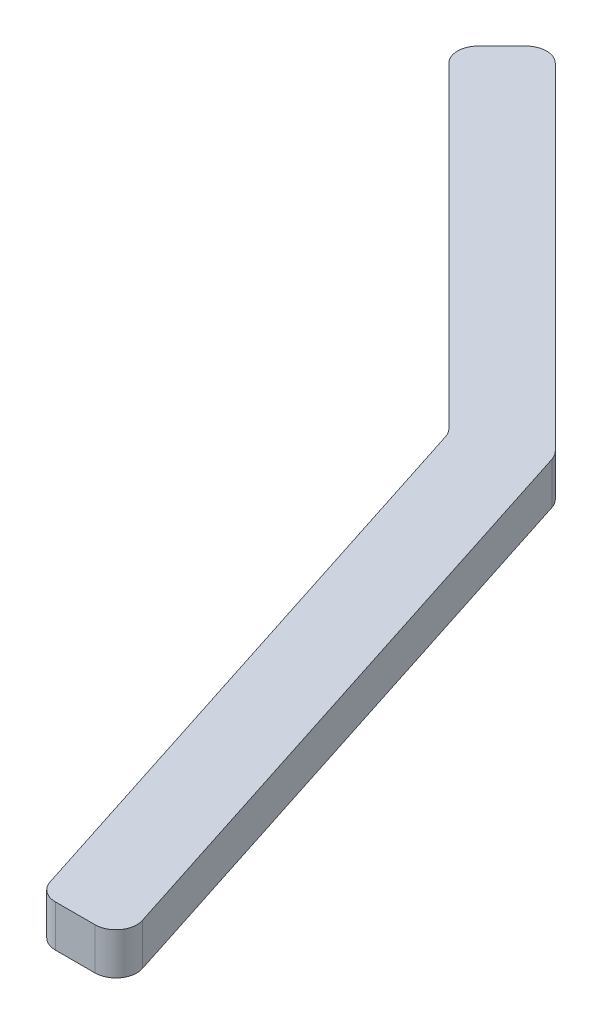
ISO-10303-21;
HEADER;
FILE_DESCRIPTION(('STEP AP214'),'2;1');
FILE_NAME('part.step','',(''),(''),'','','');
FILE_SCHEMA(('AUTOMOTIVE_DESIGN { 1 0 10303 214 1 1 1 1 }'));
ENDSEC;
DATA;
#1=APPLICATION_CONTEXT('core data for automotive mechanical design processes');
#2=APPLICATION_PROTOCOL_DEFINITION('international standard','automotive_design',2000,#1);
#3=PRODUCT_CONTEXT('',#1,'mechanical');
#4=PRODUCT('Part','Part','',(#3));
#5=PRODUCT_RELATED_PRODUCT_CATEGORY('part','',(#4));
#6=PRODUCT_DEFINITION_FORMATION('','',#4);
#7=PRODUCT_DEFINITION_CONTEXT('part definition',#1,'design');
#8=PRODUCT_DEFINITION('design','',#6,#7);
#9=PRODUCT_DEFINITION_SHAPE('','',#8);
#10=(LENGTH_UNIT() NAMED_UNIT(*) SI_UNIT(.MILLI.,.METRE.));
#11=(NAMED_UNIT(*) PLANE_ANGLE_UNIT() SI_UNIT($,.RADIAN.));
#12=(NAMED_UNIT(*) SI_UNIT($,.STERADIAN.) SOLID_ANGLE_UNIT());
#13=UNCERTAINTY_MEASURE_WITH_UNIT(LENGTH_MEASURE(1.E-05),#10,'distance_accuracy_value','');
#14=(GEOMETRIC_REPRESENTATION_CONTEXT(3) GLOBAL_UNCERTAINTY_ASSIGNED_CONTEXT((#13)) GLOBAL_UNIT_ASSIGNED_CONTEXT((#10,
#11,#12)) REPRESENTATION_CONTEXT('',''));
#15=CARTESIAN_POINT('',(0.,0.,0.));
#16=DIRECTION('',(0.,0.,1.));
#17=DIRECTION('',(1.,0.,0.));
#18=AXIS2_PLACEMENT_3D('',#15,#16,#17);
#19=CARTESIAN_POINT('',(-8.71606046304607,12.7,-6.35));
#20=DIRECTION('',(0.,-1.,0.));
#21=DIRECTION('',(0.,0.,-1.));
#22=AXIS2_PLACEMENT_3D('',#19,#20,#21);
#23=CYLINDRICAL_SURFACE('',#22,6.35);
#24=CARTESIAN_POINT('',(-8.71606046304607,0.,-6.35));
#25=DIRECTION('',(0.,1.,0.));
#26=DIRECTION('',(0.,0.,1.));
#27=AXIS2_PLACEMENT_3D('',#24,#25,#26);
#28=CIRCLE('',#27,6.35);
#29=CARTESIAN_POINT('',(-8.71606046304614,0.,0.));
#30=VERTEX_POINT('',#29);
#31=CARTESIAN_POINT('',(-2.67174592065584,0.,-8.29647417466811));
#32=VERTEX_POINT('',#31);
#33=EDGE_CURVE('E153',#30,#32,#28,.T.);
#34=ORIENTED_EDGE('',*,*,#33,.T.);
#35=DIRECTION('',(0.,-1.,0.));
#36=VECTOR('',#35,1.);
#37=CARTESIAN_POINT('',(-2.67174592065584,12.7,-8.29647417466811));
#38=LINE('',#37,#36);
#39=CARTESIAN_POINT('',(-2.67174592065584,12.7,-8.29647417466811));
#40=VERTEX_POINT('',#39);
#41=EDGE_CURVE('E11',#40,#32,#38,.T.);
#42=ORIENTED_EDGE('',*,*,#41,.F.);
#43=CARTESIAN_POINT('',(-8.71606046304607,12.7,-6.35));
#44=DIRECTION('',(0.,1.,0.));
#45=DIRECTION('',(0.,0.,1.));
#46=AXIS2_PLACEMENT_3D('',#43,#44,#45);
#47=CIRCLE('',#46,6.35);
#48=CARTESIAN_POINT('',(-8.71606046304614,12.7,0.));
#49=VERTEX_POINT('',#48);
#50=EDGE_CURVE('E176',#49,#40,#47,.T.);
#51=ORIENTED_EDGE('',*,*,#50,.F.);
#52=DIRECTION('',(0.,-1.,0.));
#53=VECTOR('',#52,1.);
#54=CARTESIAN_POINT('',(-8.71606046304614,12.7,0.));
#55=LINE('',#54,#53);
#56=EDGE_CURVE('E149',#49,#30,#55,.T.);
#57=ORIENTED_EDGE('',*,*,#56,.T.);
#58=EDGE_LOOP('',(#34,#42,#51,#57));
#59=FACE_BOUND('',#58,.T.);
#60=ADVANCED_FACE('F33',(#59),#23,.T.);
#61=CARTESIAN_POINT('',(-61.8171765724724,12.7,-191.958600935572));
#62=DIRECTION('',(-0.951860557856733,0.,0.306531366089458));
#63=DIRECTION('',(0.306531366089458,0.,0.951860557856733));
#64=AXIS2_PLACEMENT_3D('',#61,#62,#63);
#65=PLANE('',#64);
#66=DIRECTION('',(-0.306531366089458,0.,-0.951860557856733));
#67=VECTOR('',#66,1.);
#68=CARTESIAN_POINT('',(-61.8171765724724,0.,-191.958600935572));
#69=LINE('',#68,#67);
#70=CARTESIAN_POINT('',(-61.8171765724724,0.,-191.958600935572));
#71=VERTEX_POINT('',#70);
#72=EDGE_CURVE('E156',#32,#71,#69,.T.);
#73=ORIENTED_EDGE('',*,*,#72,.T.);
#74=DIRECTION('',(0.,-1.,0.));
#75=VECTOR('',#74,1.);
#76=CARTESIAN_POINT('',(-61.8171765724724,12.7,-191.958600935572));
#77=LINE('',#76,#75);
#78=CARTESIAN_POINT('',(-61.8171765724724,12.7,-191.958600935572));
#79=VERTEX_POINT('',#78);
#80=EDGE_CURVE('E41',#79,#71,#77,.T.);
#81=ORIENTED_EDGE('',*,*,#80,.F.);
#82=DIRECTION('',(-0.306531366089457,0.,-0.951860557856733));
#83=VECTOR('',#82,1.);
#84=CARTESIAN_POINT('',(-2.67174592065584,12.7,-8.29647417466811));
#85=LINE('',#84,#83);
#86=EDGE_CURVE('E104',#40,#79,#85,.T.);
#87=ORIENTED_EDGE('',*,*,#86,.F.);
#88=ORIENTED_EDGE('',*,*,#41,.T.);
#89=EDGE_LOOP('',(#73,#81,#87,#88));
#90=FACE_BOUND('',#89,.T.);
#91=ADVANCED_FACE('F253',(#90),#65,.F.);
#92=CARTESIAN_POINT('',(-67.8614911148627,12.7,-190.012126760904));
#93=DIRECTION('',(0.,-1.,0.));
#94=DIRECTION('',(0.,0.,-1.));
#95=AXIS2_PLACEMENT_3D('',#92,#93,#94);
#96=CYLINDRICAL_SURFACE('',#95,6.34999999999999);
#97=CARTESIAN_POINT('',(-67.8614911148627,0.,-190.012126760904));
#98=DIRECTION('',(0.,1.,0.));
#99=DIRECTION('',(0.,0.,1.));
#100=AXIS2_PLACEMENT_3D('',#97,#98,#99);
#101=CIRCLE('',#100,6.34999999999999);
#102=CARTESIAN_POINT('',(-63.3713630543281,0.,-194.502254821439));
#103=VERTEX_POINT('',#102);
#104=EDGE_CURVE('E158',#71,#103,#101,.T.);
#105=ORIENTED_EDGE('',*,*,#104,.T.);
#106=DIRECTION('',(0.,-1.,0.));
#107=VECTOR('',#106,1.);
#108=CARTESIAN_POINT('',(-63.3713630543281,12.7,-194.502254821439));
#109=LINE('',#108,#107);
#110=CARTESIAN_POINT('',(-63.3713630543281,12.7,-194.502254821439));
#111=VERTEX_POINT('',#110);
#112=EDGE_CURVE('E195',#111,#103,#109,.T.);
#113=ORIENTED_EDGE('',*,*,#112,.F.);
#114=CARTESIAN_POINT('',(-67.8614911148627,12.7,-190.012126760904));
#115=DIRECTION('',(0.,1.,0.));
#116=DIRECTION('',(0.,0.,1.));
#117=AXIS2_PLACEMENT_3D('',#114,#115,#116);
#118=CIRCLE('',#117,6.34999999999999);
#119=EDGE_CURVE('E203',#79,#111,#118,.T.);
#120=ORIENTED_EDGE('',*,*,#119,.F.);
#121=ORIENTED_EDGE('',*,*,#80,.T.);
#122=EDGE_LOOP('',(#105,#113,#120,#121));
#123=FACE_BOUND('',#122,.T.);
#124=ADVANCED_FACE('F201',(#123),#96,.T.);
#125=CARTESIAN_POINT('',(-65.7565798772193,12.7,-196.88747164433));
#126=DIRECTION('',(-0.707106781186548,0.,0.707106781186547));
#127=DIRECTION('',(0.707106781186547,0.,0.707106781186548));
#128=AXIS2_PLACEMENT_3D('',#125,#126,#127);
#129=PLANE('',#128);
#130=DIRECTION('',(-0.707106781186547,0.,-0.707106781186548));
#131=VECTOR('',#130,1.);
#132=CARTESIAN_POINT('',(-65.7565798772193,0.,-196.88747164433));
#133=LINE('',#132,#131);
#134=CARTESIAN_POINT('',(-165.560118981673,0.,-296.691010748783));
#135=VERTEX_POINT('',#134);
#136=EDGE_CURVE('E161',#103,#135,#133,.T.);
#137=ORIENTED_EDGE('',*,*,#136,.T.);
#138=DIRECTION('',(0.,-1.,0.));
#139=VECTOR('',#138,1.);
#140=CARTESIAN_POINT('',(-165.560118981673,12.7,-296.691010748783));
#141=LINE('',#140,#139);
#142=CARTESIAN_POINT('',(-165.560118981673,12.7,-296.691010748783));
#143=VERTEX_POINT('',#142);
#144=EDGE_CURVE('E192',#143,#135,#141,.T.);
#145=ORIENTED_EDGE('',*,*,#144,.F.);
#146=DIRECTION('',(-0.707106781186545,0.,-0.70710678118655));
#147=VECTOR('',#146,1.);
#148=CARTESIAN_POINT('',(-65.7565798772193,12.7,-196.88747164433));
#149=LINE('',#148,#147);
#150=EDGE_CURVE('E220',#111,#143,#149,.T.);
#151=ORIENTED_EDGE('',*,*,#150,.F.);
#152=ORIENTED_EDGE('',*,*,#112,.T.);
#153=EDGE_LOOP('',(#137,#145,#151,#152));
#154=FACE_BOUND('',#153,.T.);
#155=ADVANCED_FACE('F211',(#154),#129,.F.);
#156=CARTESIAN_POINT('',(-170.050247042207,12.7,-292.200882688249));
#157=DIRECTION('',(0.,-1.,0.));
#158=DIRECTION('',(0.,0.,-1.));
#159=AXIS2_PLACEMENT_3D('',#156,#157,#158);
#160=CYLINDRICAL_SURFACE('',#159,6.35000000000001);
#161=CARTESIAN_POINT('',(-170.050247042207,0.,-292.200882688249));
#162=DIRECTION('',(0.,1.,0.));
#163=DIRECTION('',(0.,0.,1.));
#164=AXIS2_PLACEMENT_3D('',#161,#162,#163);
#165=CIRCLE('',#164,6.35000000000001);
#166=CARTESIAN_POINT('',(-174.540375102742,0.,-296.691010748783));
#167=VERTEX_POINT('',#166);
#168=EDGE_CURVE('E163',#135,#167,#165,.T.);
#169=ORIENTED_EDGE('',*,*,#168,.T.);
#170=DIRECTION('',(0.,-1.,0.));
#171=VECTOR('',#170,1.);
#172=CARTESIAN_POINT('',(-174.540375102742,12.7,-296.691010748783));
#173=LINE('',#172,#171);
#174=CARTESIAN_POINT('',(-174.540375102742,12.7,-296.691010748783));
#175=VERTEX_POINT('',#174);
#176=EDGE_CURVE('E189',#175,#167,#173,.T.);
#177=ORIENTED_EDGE('',*,*,#176,.F.);
#178=CARTESIAN_POINT('',(-170.050247042207,12.7,-292.200882688249));
#179=DIRECTION('',(0.,1.,0.));
#180=DIRECTION('',(0.,0.,1.));
#181=AXIS2_PLACEMENT_3D('',#178,#179,#180);
#182=CIRCLE('',#181,6.35000000000001);
#183=EDGE_CURVE('E217',#143,#175,#182,.T.);
#184=ORIENTED_EDGE('',*,*,#183,.F.);
#185=ORIENTED_EDGE('',*,*,#144,.T.);
#186=EDGE_LOOP('',(#169,#177,#184,#185));
#187=FACE_BOUND('',#186,.T.);
#188=ADVANCED_FACE('F215',(#187),#160,.T.);
#189=CARTESIAN_POINT('',(-174.540375102742,12.7,-296.691010748783));
#190=DIRECTION('',(0.707106781186549,0.,0.707106781186546));
#191=DIRECTION('',(0.707106781186546,0.,-0.707106781186549));
#192=AXIS2_PLACEMENT_3D('',#189,#190,#191);
#193=PLANE('',#192);
#194=DIRECTION('',(-0.707106781186546,0.,0.707106781186549));
#195=VECTOR('',#194,1.);
#196=CARTESIAN_POINT('',(-174.540375102742,0.,-296.691010748783));
#197=LINE('',#196,#195);
#198=CARTESIAN_POINT('',(-181.724579999597,0.,-289.506805851928));
#199=VERTEX_POINT('',#198);
#200=EDGE_CURVE('E165',#167,#199,#197,.T.);
#201=ORIENTED_EDGE('',*,*,#200,.T.);
#202=DIRECTION('',(0.,-1.,0.));
#203=VECTOR('',#202,1.);
#204=CARTESIAN_POINT('',(-181.724579999597,12.7,-289.506805851928));
#205=LINE('',#204,#203);
#206=CARTESIAN_POINT('',(-181.724579999597,12.7,-289.506805851928));
#207=VERTEX_POINT('',#206);
#208=EDGE_CURVE('E186',#207,#199,#205,.T.);
#209=ORIENTED_EDGE('',*,*,#208,.F.);
#210=DIRECTION('',(-0.707106781186546,0.,0.707106781186549));
#211=VECTOR('',#210,1.);
#212=CARTESIAN_POINT('',(-174.540375102742,12.7,-296.691010748783));
#213=LINE('',#212,#211);
#214=EDGE_CURVE('E219',#175,#207,#213,.T.);
#215=ORIENTED_EDGE('',*,*,#214,.F.);
#216=ORIENTED_EDGE('',*,*,#176,.T.);
#217=EDGE_LOOP('',(#201,#209,#215,#216));
#218=FACE_BOUND('',#217,.T.);
#219=ADVANCED_FACE('F266',(#218),#193,.F.);
#220=CARTESIAN_POINT('',(-177.234451939063,12.7,-285.016677791393));
#221=DIRECTION('',(0.,-1.,0.));
#222=DIRECTION('',(0.,0.,-1.));
#223=AXIS2_PLACEMENT_3D('',#220,#221,#222);
#224=CYLINDRICAL_SURFACE('',#223,6.34999999999997);
#225=CARTESIAN_POINT('',(-177.234451939063,0.,-285.016677791393));
#226=DIRECTION('',(0.,1.,0.));
#227=DIRECTION('',(0.,0.,1.));
#228=AXIS2_PLACEMENT_3D('',#225,#226,#227);
#229=CIRCLE('',#228,6.34999999999997);
#230=CARTESIAN_POINT('',(-181.724579999597,0.,-280.526549730859));
#231=VERTEX_POINT('',#230);
#232=EDGE_CURVE('E167',#199,#231,#229,.T.);
#233=ORIENTED_EDGE('',*,*,#232,.T.);
#234=DIRECTION('',(0.,-1.,0.));
#235=VECTOR('',#234,1.);
#236=CARTESIAN_POINT('',(-181.724579999597,12.7,-280.526549730859));
#237=LINE('',#236,#235);
#238=CARTESIAN_POINT('',(-181.724579999597,12.7,-280.526549730859));
#239=VERTEX_POINT('',#238);
#240=EDGE_CURVE('E183',#239,#231,#237,.T.);
#241=ORIENTED_EDGE('',*,*,#240,.F.);
#242=CARTESIAN_POINT('',(-177.234451939063,12.7,-285.016677791393));
#243=DIRECTION('',(0.,1.,0.));
#244=DIRECTION('',(0.,0.,1.));
#245=AXIS2_PLACEMENT_3D('',#242,#243,#244);
#246=CIRCLE('',#245,6.34999999999997);
#247=EDGE_CURVE('E222',#207,#239,#246,.T.);
#248=ORIENTED_EDGE('',*,*,#247,.F.);
#249=ORIENTED_EDGE('',*,*,#208,.T.);
#250=EDGE_LOOP('',(#233,#241,#248,#249));
#251=FACE_BOUND('',#250,.T.);
#252=ADVANCED_FACE('F269',(#251),#224,.T.);
#253=CARTESIAN_POINT('',(-181.724579999597,12.7,-280.526549730859));
#254=DIRECTION('',(0.707106781186548,0.,-0.707106781186547));
#255=DIRECTION('',(-0.707106781186547,0.,-0.707106781186548));
#256=AXIS2_PLACEMENT_3D('',#253,#254,#255);
#257=PLANE('',#256);
#258=DIRECTION('',(0.707106781186547,0.,0.707106781186548));
#259=VECTOR('',#258,1.);
#260=CARTESIAN_POINT('',(-181.724579999597,0.,-280.526549730859));
#261=LINE('',#260,#259);
#262=CARTESIAN_POINT('',(-85.4801250872999,0.,-184.282094818562));
#263=VERTEX_POINT('',#262);
#264=EDGE_CURVE('E169',#231,#263,#261,.T.);
#265=ORIENTED_EDGE('',*,*,#264,.T.);
#266=DIRECTION('',(0.,-1.,0.));
#267=VECTOR('',#266,1.);
#268=CARTESIAN_POINT('',(-85.4801250872999,12.7,-184.282094818562));
#269=LINE('',#268,#267);
#270=CARTESIAN_POINT('',(-85.4801250872999,12.7,-184.282094818562));
#271=VERTEX_POINT('',#270);
#272=EDGE_CURVE('E180',#271,#263,#269,.T.);
#273=ORIENTED_EDGE('',*,*,#272,.F.);
#274=DIRECTION('',(0.707106781186547,0.,0.707106781186548));
#275=VECTOR('',#274,1.);
#276=CARTESIAN_POINT('',(-181.724579999597,12.7,-280.526549730859));
#277=LINE('',#276,#275);
#278=EDGE_CURVE('E228',#239,#271,#277,.T.);
#279=ORIENTED_EDGE('',*,*,#278,.F.);
#280=ORIENTED_EDGE('',*,*,#240,.T.);
#281=EDGE_LOOP('',(#265,#273,#279,#280));
#282=FACE_BOUND('',#281,.T.);
#283=ADVANCED_FACE('F234',(#282),#257,.F.);
#284=CARTESIAN_POINT('',(-89.9702531478345,12.7,-179.791966758027));
#285=DIRECTION('',(0.,-1.,0.));
#286=DIRECTION('',(0.,0.,-1.));
#287=AXIS2_PLACEMENT_3D('',#284,#285,#286);
#288=CYLINDRICAL_SURFACE('',#287,6.35000000000002);
#289=CARTESIAN_POINT('',(-89.9702531478345,0.,-179.791966758027));
#290=DIRECTION('',(0.,-1.,0.));
#291=DIRECTION('',(0.,0.,1.));
#292=AXIS2_PLACEMENT_3D('',#289,#290,#291);
#293=CIRCLE('',#292,6.35000000000002);
#294=CARTESIAN_POINT('',(-83.9259386054442,0.,-181.738440932695));
#295=VERTEX_POINT('',#294);
#296=EDGE_CURVE('E171',#263,#295,#293,.T.);
#297=ORIENTED_EDGE('',*,*,#296,.T.);
#298=DIRECTION('',(0.,-1.,0.));
#299=VECTOR('',#298,1.);
#300=CARTESIAN_POINT('',(-83.9259386054442,12.7,-181.738440932695));
#301=LINE('',#300,#299);
#302=CARTESIAN_POINT('',(-83.9259386054442,12.7,-181.738440932695));
#303=VERTEX_POINT('',#302);
#304=EDGE_CURVE('E144',#303,#295,#301,.T.);
#305=ORIENTED_EDGE('',*,*,#304,.F.);
#306=CARTESIAN_POINT('',(-89.9702531478345,12.7,-179.791966758027));
#307=DIRECTION('',(0.,-1.,0.));
#308=DIRECTION('',(0.,0.,1.));
#309=AXIS2_PLACEMENT_3D('',#306,#307,#308);
#310=CIRCLE('',#309,6.35000000000002);
#311=EDGE_CURVE('E135',#271,#303,#310,.T.);
#312=ORIENTED_EDGE('',*,*,#311,.F.);
#313=ORIENTED_EDGE('',*,*,#272,.T.);
#314=EDGE_LOOP('',(#297,#305,#312,#313));
#315=FACE_BOUND('',#314,.T.);
#316=ADVANCED_FACE('F238',(#315),#288,.F.);
#317=CARTESIAN_POINT('',(-83.9259386054442,12.7,-181.738440932695));
#318=DIRECTION('',(0.951860557856733,0.,-0.306531366089457));
#319=DIRECTION('',(-0.306531366089457,0.,-0.951860557856733));
#320=AXIS2_PLACEMENT_3D('',#317,#318,#319);
#321=PLANE('',#320);
#322=DIRECTION('',(0.306531366089457,0.,0.951860557856733));
#323=VECTOR('',#322,1.);
#324=CARTESIAN_POINT('',(-83.9259386054442,0.,-181.738440932695));
#325=LINE('',#324,#323);
#326=CARTESIAN_POINT('',(-26.8180845878188,0.,-4.40352582533198));
#327=VERTEX_POINT('',#326);
#328=EDGE_CURVE('E143',#295,#327,#325,.T.);
#329=ORIENTED_EDGE('',*,*,#328,.T.);
#330=DIRECTION('',(0.,-1.,0.));
#331=VECTOR('',#330,1.);
#332=CARTESIAN_POINT('',(-26.8180845878188,12.7,-4.40352582533198));
#333=LINE('',#332,#331);
#334=CARTESIAN_POINT('',(-26.8180845878188,12.7,-4.40352582533198));
#335=VERTEX_POINT('',#334);
#336=EDGE_CURVE('E140',#335,#327,#333,.T.);
#337=ORIENTED_EDGE('',*,*,#336,.F.);
#338=DIRECTION('',(0.306531366089457,0.,0.951860557856733));
#339=VECTOR('',#338,1.);
#340=CARTESIAN_POINT('',(-83.9259386054442,12.7,-181.738440932695));
#341=LINE('',#340,#339);
#342=EDGE_CURVE('E129',#303,#335,#341,.T.);
#343=ORIENTED_EDGE('',*,*,#342,.F.);
#344=ORIENTED_EDGE('',*,*,#304,.T.);
#345=EDGE_LOOP('',(#329,#337,#343,#344));
#346=FACE_BOUND('',#345,.T.);
#347=ADVANCED_FACE('F141',(#346),#321,.F.);
#348=CARTESIAN_POINT('',(-20.7737700454285,12.7,-6.35));
#349=DIRECTION('',(0.,-1.,0.));
#350=DIRECTION('',(0.,0.,-1.));
#351=AXIS2_PLACEMENT_3D('',#348,#349,#350);
#352=CYLINDRICAL_SURFACE('',#351,6.35);
#353=CARTESIAN_POINT('',(-20.7737700454285,0.,-6.35));
#354=DIRECTION('',(0.,1.,0.));
#355=DIRECTION('',(0.,0.,-1.));
#356=AXIS2_PLACEMENT_3D('',#353,#354,#355);
#357=CIRCLE('',#356,6.35);
#358=CARTESIAN_POINT('',(-20.7737700454285,0.,0.));
#359=VERTEX_POINT('',#358);
#360=EDGE_CURVE('E90',#327,#359,#357,.T.);
#361=ORIENTED_EDGE('',*,*,#360,.T.);
#362=DIRECTION('',(0.,-1.,0.));
#363=VECTOR('',#362,1.);
#364=CARTESIAN_POINT('',(-20.7737700454285,12.7,0.));
#365=LINE('',#364,#363);
#366=CARTESIAN_POINT('',(-20.7737700454285,12.7,0.));
#367=VERTEX_POINT('',#366);
#368=EDGE_CURVE('E145',#367,#359,#365,.T.);
#369=ORIENTED_EDGE('',*,*,#368,.F.);
#370=CARTESIAN_POINT('',(-20.7737700454285,12.7,-6.35));
#371=DIRECTION('',(0.,1.,0.));
#372=DIRECTION('',(0.,0.,-1.));
#373=AXIS2_PLACEMENT_3D('',#370,#371,#372);
#374=CIRCLE('',#373,6.35);
#375=EDGE_CURVE('E133',#335,#367,#374,.T.);
#376=ORIENTED_EDGE('',*,*,#375,.F.);
#377=ORIENTED_EDGE('',*,*,#336,.T.);
#378=EDGE_LOOP('',(#361,#369,#376,#377));
#379=FACE_BOUND('',#378,.T.);
#380=ADVANCED_FACE('F147',(#379),#352,.T.);
#381=CARTESIAN_POINT('',(-20.7737700454285,12.7,0.));
#382=DIRECTION('',(0.,0.,-1.));
#383=DIRECTION('',(-1.,0.,0.));
#384=AXIS2_PLACEMENT_3D('',#381,#382,#383);
#385=PLANE('',#384);
#386=DIRECTION('',(1.,0.,0.));
#387=VECTOR('',#386,1.);
#388=CARTESIAN_POINT('',(-20.7737700454285,0.,0.));
#389=LINE('',#388,#387);
#390=EDGE_CURVE('E96',#359,#30,#389,.T.);
#391=ORIENTED_EDGE('',*,*,#390,.T.);
#392=ORIENTED_EDGE('',*,*,#56,.F.);
#393=DIRECTION('',(1.,0.,0.));
#394=VECTOR('',#393,1.);
#395=CARTESIAN_POINT('',(-20.7737700454285,12.7,0.));
#396=LINE('',#395,#394);
#397=EDGE_CURVE('E49',#367,#49,#396,.T.);
#398=ORIENTED_EDGE('',*,*,#397,.F.);
#399=ORIENTED_EDGE('',*,*,#368,.T.);
#400=EDGE_LOOP('',(#391,#392,#398,#399));
#401=FACE_BOUND('',#400,.T.);
#402=ADVANCED_FACE('F242',(#401),#385,.F.);
#403=CARTESIAN_POINT('',(-8.71606046304607,12.7,-6.35));
#404=DIRECTION('',(0.,1.,0.));
#405=DIRECTION('',(0.,0.,1.));
#406=AXIS2_PLACEMENT_3D('',#403,#404,#405);
#407=PLANE('',#406);
#408=ORIENTED_EDGE('',*,*,#50,.T.);
#409=ORIENTED_EDGE('',*,*,#86,.T.);
#410=ORIENTED_EDGE('',*,*,#119,.T.);
#411=ORIENTED_EDGE('',*,*,#150,.T.);
#412=ORIENTED_EDGE('',*,*,#183,.T.);
#413=ORIENTED_EDGE('',*,*,#214,.T.);
#414=ORIENTED_EDGE('',*,*,#247,.T.);
#415=ORIENTED_EDGE('',*,*,#278,.T.);
#416=ORIENTED_EDGE('',*,*,#311,.T.);
#417=ORIENTED_EDGE('',*,*,#342,.T.);
#418=ORIENTED_EDGE('',*,*,#375,.T.);
#419=ORIENTED_EDGE('',*,*,#397,.T.);
#420=EDGE_LOOP('',(#408,#409,#410,#411,#412,#413,#414,#415,#416,#417,#418,#419));
#421=FACE_BOUND('',#420,.T.);
#422=ADVANCED_FACE('F131',(#421),#407,.T.);
#423=CARTESIAN_POINT('',(-8.71606046304607,0.,-6.35));
#424=DIRECTION('',(0.,1.,0.));
#425=DIRECTION('',(0.,0.,1.));
#426=AXIS2_PLACEMENT_3D('',#423,#424,#425);
#427=PLANE('',#426);
#428=ORIENTED_EDGE('',*,*,#33,.F.);
#429=ORIENTED_EDGE('',*,*,#390,.F.);
#430=ORIENTED_EDGE('',*,*,#360,.F.);
#431=ORIENTED_EDGE('',*,*,#328,.F.);
#432=ORIENTED_EDGE('',*,*,#296,.F.);
#433=ORIENTED_EDGE('',*,*,#264,.F.);
#434=ORIENTED_EDGE('',*,*,#232,.F.);
#435=ORIENTED_EDGE('',*,*,#200,.F.);
#436=ORIENTED_EDGE('',*,*,#168,.F.);
#437=ORIENTED_EDGE('',*,*,#136,.F.);
#438=ORIENTED_EDGE('',*,*,#104,.F.);
#439=ORIENTED_EDGE('',*,*,#72,.F.);
#440=EDGE_LOOP('',(#428,#429,#430,#431,#432,#433,#434,#435,#436,#437,#438,#439));
#441=FACE_BOUND('',#440,.T.);
#442=ADVANCED_FACE('F206',(#441),#427,.F.);
#443=CLOSED_SHELL('',(#60,#91,#124,#155,#188,#219,#252,#283,#316,#347,#380,#402,#422,#442));
#444=MANIFOLD_SOLID_BREP('B2',#443);
#445=ADVANCED_BREP_SHAPE_REPRESENTATION('',(#18,#444),#14);
#446=SHAPE_DEFINITION_REPRESENTATION(#9,#445);
ENDSEC;
END-ISO-10303-21;
